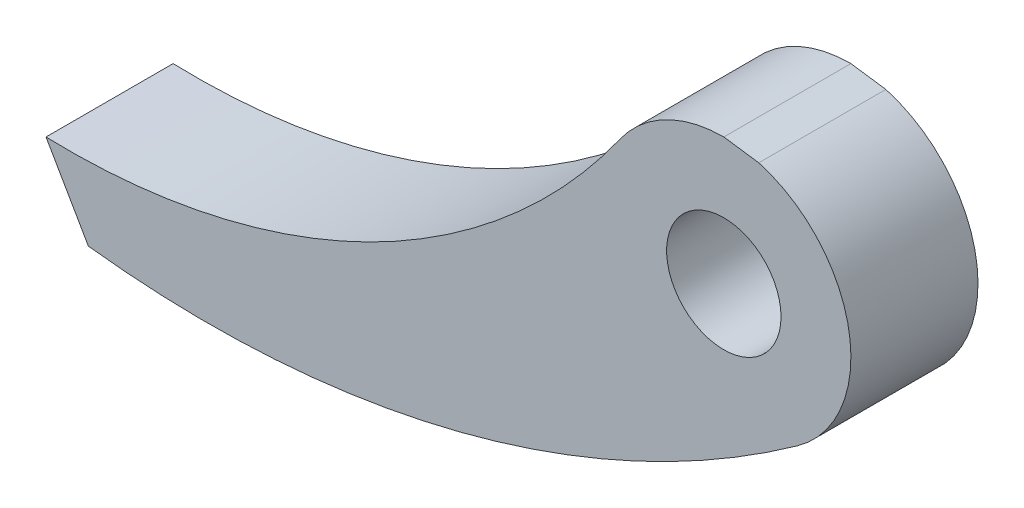
ISO-10303-21;
HEADER;
FILE_DESCRIPTION(('STEP AP214'),'2;1');
FILE_NAME('part.step','',(''),(''),'','','');
FILE_SCHEMA(('AUTOMOTIVE_DESIGN { 1 0 10303 214 1 1 1 1 }'));
ENDSEC;
DATA;
#1=APPLICATION_CONTEXT('core data for automotive mechanical design processes');
#2=APPLICATION_PROTOCOL_DEFINITION('international standard','automotive_design',2000,#1);
#3=PRODUCT_CONTEXT('',#1,'mechanical');
#4=PRODUCT('Part','Part','',(#3));
#5=PRODUCT_RELATED_PRODUCT_CATEGORY('part','',(#4));
#6=PRODUCT_DEFINITION_FORMATION('','',#4);
#7=PRODUCT_DEFINITION_CONTEXT('part definition',#1,'design');
#8=PRODUCT_DEFINITION('design','',#6,#7);
#9=PRODUCT_DEFINITION_SHAPE('','',#8);
#10=(LENGTH_UNIT() NAMED_UNIT(*) SI_UNIT(.MILLI.,.METRE.));
#11=(NAMED_UNIT(*) PLANE_ANGLE_UNIT() SI_UNIT($,.RADIAN.));
#12=(NAMED_UNIT(*) SI_UNIT($,.STERADIAN.) SOLID_ANGLE_UNIT());
#13=UNCERTAINTY_MEASURE_WITH_UNIT(LENGTH_MEASURE(1.E-05),#10,'distance_accuracy_value','');
#14=(GEOMETRIC_REPRESENTATION_CONTEXT(3) GLOBAL_UNCERTAINTY_ASSIGNED_CONTEXT((#13)) GLOBAL_UNIT_ASSIGNED_CONTEXT((#10,
#11,#12)) REPRESENTATION_CONTEXT('',''));
#15=CARTESIAN_POINT('',(0.,0.,0.));
#16=DIRECTION('',(0.,0.,1.));
#17=DIRECTION('',(1.,0.,0.));
#18=AXIS2_PLACEMENT_3D('',#15,#16,#17);
#19=CARTESIAN_POINT('',(-12.1863189266753,17.1024451765633,1.5));
#20=DIRECTION('',(0.,0.,-1.));
#21=DIRECTION('',(-1.,0.,0.));
#22=AXIS2_PLACEMENT_3D('',#19,#20,#21);
#23=CYLINDRICAL_SURFACE('',#22,24.);
#24=CARTESIAN_POINT('',(-12.1863189266753,17.1024451765633,-1.5));
#25=DIRECTION('',(0.,0.,1.));
#26=DIRECTION('',(1.,0.,0.));
#27=AXIS2_PLACEMENT_3D('',#24,#25,#26);
#28=CIRCLE('',#27,24.);
#29=CARTESIAN_POINT('',(-15.,-6.73205080756887,-1.5));
#30=VERTEX_POINT('',#29);
#31=CARTESIAN_POINT('',(1.74090270381076,-2.44320645379476,-1.5));
#32=VERTEX_POINT('',#31);
#33=EDGE_CURVE('E131',#30,#32,#28,.T.);
#34=ORIENTED_EDGE('',*,*,#33,.T.);
#35=DIRECTION('',(0.,0.,-1.));
#36=VECTOR('',#35,1.);
#37=CARTESIAN_POINT('',(1.74090270381076,-2.44320645379476,1.5));
#38=LINE('',#37,#36);
#39=CARTESIAN_POINT('',(1.74090270381076,-2.44320645379476,1.5));
#40=VERTEX_POINT('',#39);
#41=EDGE_CURVE('E11',#40,#32,#38,.T.);
#42=ORIENTED_EDGE('',*,*,#41,.F.);
#43=CARTESIAN_POINT('',(-12.1863189266753,17.1024451765633,1.5));
#44=DIRECTION('',(0.,0.,1.));
#45=DIRECTION('',(1.,0.,0.));
#46=AXIS2_PLACEMENT_3D('',#43,#44,#45);
#47=CIRCLE('',#46,24.);
#48=CARTESIAN_POINT('',(-15.,-6.73205080756887,1.5));
#49=VERTEX_POINT('',#48);
#50=EDGE_CURVE('E146',#49,#40,#47,.T.);
#51=ORIENTED_EDGE('',*,*,#50,.F.);
#52=DIRECTION('',(0.,0.,-1.));
#53=VECTOR('',#52,1.);
#54=CARTESIAN_POINT('',(-15.,-6.73205080756887,1.5));
#55=LINE('',#54,#53);
#56=EDGE_CURVE('E130',#49,#30,#55,.T.);
#57=ORIENTED_EDGE('',*,*,#56,.T.);
#58=EDGE_LOOP('',(#34,#42,#51,#57));
#59=FACE_BOUND('',#58,.T.);
#60=ADVANCED_FACE('F45',(#59),#23,.T.);
#61=CARTESIAN_POINT('',(0.,0.,1.5));
#62=DIRECTION('',(0.,0.,-1.));
#63=DIRECTION('',(-1.,0.,0.));
#64=AXIS2_PLACEMENT_3D('',#61,#62,#63);
#65=CYLINDRICAL_SURFACE('',#64,3.);
#66=CARTESIAN_POINT('',(0.,0.,-1.5));
#67=DIRECTION('',(0.,0.,1.));
#68=DIRECTION('',(1.,0.,0.));
#69=AXIS2_PLACEMENT_3D('',#66,#67,#68);
#70=CIRCLE('',#69,3.);
#71=CARTESIAN_POINT('',(0.824491602471951,2.88447804593019,-1.5));
#72=VERTEX_POINT('',#71);
#73=EDGE_CURVE('E134',#32,#72,#70,.T.);
#74=ORIENTED_EDGE('',*,*,#73,.T.);
#75=DIRECTION('',(0.,0.,-1.));
#76=VECTOR('',#75,1.);
#77=CARTESIAN_POINT('',(0.824491602471951,2.88447804593019,1.5));
#78=LINE('',#77,#76);
#79=CARTESIAN_POINT('',(0.824491602471951,2.88447804593019,1.5));
#80=VERTEX_POINT('',#79);
#81=EDGE_CURVE('E53',#80,#72,#78,.T.);
#82=ORIENTED_EDGE('',*,*,#81,.F.);
#83=CARTESIAN_POINT('',(0.,0.,1.5));
#84=DIRECTION('',(0.,0.,1.));
#85=DIRECTION('',(1.,0.,0.));
#86=AXIS2_PLACEMENT_3D('',#83,#84,#85);
#87=CIRCLE('',#86,3.);
#88=EDGE_CURVE('E94',#40,#80,#87,.T.);
#89=ORIENTED_EDGE('',*,*,#88,.F.);
#90=ORIENTED_EDGE('',*,*,#41,.T.);
#91=EDGE_LOOP('',(#74,#82,#89,#90));
#92=FACE_BOUND('',#91,.T.);
#93=ADVANCED_FACE('F152',(#92),#65,.T.);
#94=CARTESIAN_POINT('',(0.412245801235974,2.94223902296509,1.5));
#95=DIRECTION('',(0.138757554791209,0.990326381042313,0.));
#96=DIRECTION('',(-0.990326381042313,0.138757554791209,0.));
#97=AXIS2_PLACEMENT_3D('',#94,#95,#96);
#98=PLANE('',#97);
#99=DIRECTION('',(0.990326381042313,-0.138757554791209,0.));
#100=VECTOR('',#99,1.);
#101=CARTESIAN_POINT('',(0.412245801235974,2.94223902296509,-1.5));
#102=LINE('',#101,#100);
#103=CARTESIAN_POINT('',(0.,3.,-1.5));
#104=VERTEX_POINT('',#103);
#105=EDGE_CURVE('E137',#104,#72,#102,.T.);
#106=ORIENTED_EDGE('',*,*,#105,.F.);
#107=DIRECTION('',(0.,0.,-1.));
#108=VECTOR('',#107,1.);
#109=CARTESIAN_POINT('',(0.,3.,1.5));
#110=LINE('',#109,#108);
#111=CARTESIAN_POINT('',(0.,3.,1.5));
#112=VERTEX_POINT('',#111);
#113=EDGE_CURVE('E120',#112,#104,#110,.T.);
#114=ORIENTED_EDGE('',*,*,#113,.F.);
#115=DIRECTION('',(0.990326381042313,-0.138757554791209,0.));
#116=VECTOR('',#115,1.);
#117=CARTESIAN_POINT('',(0.412245801235974,2.94223902296509,1.5));
#118=LINE('',#117,#116);
#119=EDGE_CURVE('E109',#112,#80,#118,.T.);
#120=ORIENTED_EDGE('',*,*,#119,.T.);
#121=ORIENTED_EDGE('',*,*,#81,.T.);
#122=EDGE_LOOP('',(#106,#114,#120,#121));
#123=FACE_BOUND('',#122,.T.);
#124=ADVANCED_FACE('F151',(#123),#98,.T.);
#125=CARTESIAN_POINT('',(-2.44697902777808,1.73559604678458,-1.5));
#126=VERTEX_POINT('',#125);
#127=EDGE_CURVE('E116',#104,#126,#70,.T.);
#128=ORIENTED_EDGE('',*,*,#127,.T.);
#129=DIRECTION('',(0.,0.,-1.));
#130=VECTOR('',#129,1.);
#131=CARTESIAN_POINT('',(-2.44697902777808,1.73559604678458,1.5));
#132=LINE('',#131,#130);
#133=CARTESIAN_POINT('',(-2.44697902777808,1.73559604678458,1.5));
#134=VERTEX_POINT('',#133);
#135=EDGE_CURVE('E113',#134,#126,#132,.T.);
#136=ORIENTED_EDGE('',*,*,#135,.F.);
#137=EDGE_CURVE('E102',#112,#134,#87,.T.);
#138=ORIENTED_EDGE('',*,*,#137,.F.);
#139=ORIENTED_EDGE('',*,*,#113,.T.);
#140=EDGE_LOOP('',(#128,#136,#138,#139));
#141=FACE_BOUND('',#140,.T.);
#142=ADVANCED_FACE('F114',(#141),#65,.T.);
#143=CARTESIAN_POINT('',(-15.4975338425945,10.9921082963023,1.5));
#144=DIRECTION('',(0.,0.,-1.));
#145=DIRECTION('',(-1.,0.,0.));
#146=AXIS2_PLACEMENT_3D('',#143,#144,#145);
#147=CYLINDRICAL_SURFACE('',#146,16.);
#148=CARTESIAN_POINT('',(-15.4975338425945,10.9921082963023,-1.5));
#149=DIRECTION('',(0.,0.,1.));
#150=DIRECTION('',(1.,0.,0.));
#151=AXIS2_PLACEMENT_3D('',#148,#149,#150);
#152=CIRCLE('',#151,16.);
#153=CARTESIAN_POINT('',(-16.,-5.,-1.5));
#154=VERTEX_POINT('',#153);
#155=EDGE_CURVE('E140',#154,#126,#152,.T.);
#156=ORIENTED_EDGE('',*,*,#155,.F.);
#157=DIRECTION('',(0.,0.,-1.));
#158=VECTOR('',#157,1.);
#159=CARTESIAN_POINT('',(-16.,-5.,1.5));
#160=LINE('',#159,#158);
#161=CARTESIAN_POINT('',(-16.,-5.,1.5));
#162=VERTEX_POINT('',#161);
#163=EDGE_CURVE('E83',#162,#154,#160,.T.);
#164=ORIENTED_EDGE('',*,*,#163,.F.);
#165=CARTESIAN_POINT('',(-15.4975338425945,10.9921082963023,1.5));
#166=DIRECTION('',(0.,0.,1.));
#167=DIRECTION('',(1.,0.,0.));
#168=AXIS2_PLACEMENT_3D('',#165,#166,#167);
#169=CIRCLE('',#168,16.);
#170=EDGE_CURVE('E107',#162,#134,#169,.T.);
#171=ORIENTED_EDGE('',*,*,#170,.T.);
#172=ORIENTED_EDGE('',*,*,#135,.T.);
#173=EDGE_LOOP('',(#156,#164,#171,#172));
#174=FACE_BOUND('',#173,.T.);
#175=ADVANCED_FACE('F122',(#174),#147,.F.);
#176=CARTESIAN_POINT('',(-14.1650635094611,-8.17820323027555,1.5));
#177=DIRECTION('',(0.866025403784437,0.500000000000003,0.));
#178=DIRECTION('',(-0.500000000000003,0.866025403784437,0.));
#179=AXIS2_PLACEMENT_3D('',#176,#177,#178);
#180=PLANE('',#179);
#181=DIRECTION('',(0.500000000000003,-0.866025403784437,0.));
#182=VECTOR('',#181,1.);
#183=CARTESIAN_POINT('',(-14.1650635094611,-8.17820323027555,-1.5));
#184=LINE('',#183,#182);
#185=EDGE_CURVE('E86',#154,#30,#184,.T.);
#186=ORIENTED_EDGE('',*,*,#185,.T.);
#187=ORIENTED_EDGE('',*,*,#56,.F.);
#188=DIRECTION('',(0.500000000000003,-0.866025403784437,0.));
#189=VECTOR('',#188,1.);
#190=CARTESIAN_POINT('',(-14.1650635094611,-8.17820323027555,1.5));
#191=LINE('',#190,#189);
#192=EDGE_CURVE('E61',#162,#49,#191,.T.);
#193=ORIENTED_EDGE('',*,*,#192,.F.);
#194=ORIENTED_EDGE('',*,*,#163,.T.);
#195=EDGE_LOOP('',(#186,#187,#193,#194));
#196=FACE_BOUND('',#195,.T.);
#197=ADVANCED_FACE('F160',(#196),#180,.F.);
#198=CARTESIAN_POINT('',(0.,0.,1.5));
#199=DIRECTION('',(0.,0.,-1.));
#200=DIRECTION('',(-1.,0.,0.));
#201=AXIS2_PLACEMENT_3D('',#198,#199,#200);
#202=CYLINDRICAL_SURFACE('',#201,1.35);
#203=CARTESIAN_POINT('',(0.,0.,1.5));
#204=DIRECTION('',(0.,0.,1.));
#205=DIRECTION('',(1.,0.,0.));
#206=AXIS2_PLACEMENT_3D('',#203,#204,#205);
#207=CIRCLE('',#206,1.35);
#208=CARTESIAN_POINT('',(1.35,0.,1.5));
#209=VERTEX_POINT('',#208);
#210=EDGE_CURVE('E124',#209,#209,#207,.T.);
#211=ORIENTED_EDGE('',*,*,#210,.T.);
#212=EDGE_LOOP('',(#211));
#213=FACE_BOUND('',#212,.T.);
#214=CARTESIAN_POINT('',(0.,0.,-1.5));
#215=DIRECTION('',(0.,0.,1.));
#216=DIRECTION('',(1.,0.,0.));
#217=AXIS2_PLACEMENT_3D('',#214,#215,#216);
#218=CIRCLE('',#217,1.35);
#219=CARTESIAN_POINT('',(1.35,0.,-1.5));
#220=VERTEX_POINT('',#219);
#221=EDGE_CURVE('E143',#220,#220,#218,.T.);
#222=ORIENTED_EDGE('',*,*,#221,.F.);
#223=EDGE_LOOP('',(#222));
#224=FACE_BOUND('',#223,.T.);
#225=ADVANCED_FACE('F162',(#213,#224),#202,.F.);
#226=CARTESIAN_POINT('',(0.,0.,1.5));
#227=DIRECTION('',(0.,0.,1.));
#228=DIRECTION('',(1.,0.,0.));
#229=AXIS2_PLACEMENT_3D('',#226,#227,#228);
#230=PLANE('',#229);
#231=ORIENTED_EDGE('',*,*,#50,.T.);
#232=ORIENTED_EDGE('',*,*,#88,.T.);
#233=ORIENTED_EDGE('',*,*,#119,.F.);
#234=ORIENTED_EDGE('',*,*,#137,.T.);
#235=ORIENTED_EDGE('',*,*,#170,.F.);
#236=ORIENTED_EDGE('',*,*,#192,.T.);
#237=EDGE_LOOP('',(#231,#232,#233,#234,#235,#236));
#238=FACE_BOUND('',#237,.T.);
#239=ORIENTED_EDGE('',*,*,#210,.F.);
#240=EDGE_LOOP('',(#239));
#241=FACE_BOUND('',#240,.T.);
#242=ADVANCED_FACE('F104',(#238,#241),#230,.T.);
#243=CARTESIAN_POINT('',(0.,0.,-1.5));
#244=DIRECTION('',(0.,0.,1.));
#245=DIRECTION('',(1.,0.,0.));
#246=AXIS2_PLACEMENT_3D('',#243,#244,#245);
#247=PLANE('',#246);
#248=ORIENTED_EDGE('',*,*,#33,.F.);
#249=ORIENTED_EDGE('',*,*,#185,.F.);
#250=ORIENTED_EDGE('',*,*,#155,.T.);
#251=ORIENTED_EDGE('',*,*,#127,.F.);
#252=ORIENTED_EDGE('',*,*,#105,.T.);
#253=ORIENTED_EDGE('',*,*,#73,.F.);
#254=EDGE_LOOP('',(#248,#249,#250,#251,#252,#253));
#255=FACE_BOUND('',#254,.T.);
#256=ORIENTED_EDGE('',*,*,#221,.T.);
#257=EDGE_LOOP('',(#256));
#258=FACE_BOUND('',#257,.T.);
#259=ADVANCED_FACE('F156',(#255,#258),#247,.F.);
#260=CLOSED_SHELL('',(#60,#93,#124,#142,#175,#197,#225,#242,#259));
#261=MANIFOLD_SOLID_BREP('B2',#260);
#262=ADVANCED_BREP_SHAPE_REPRESENTATION('',(#18,#261),#14);
#263=SHAPE_DEFINITION_REPRESENTATION(#9,#262);
ENDSEC;
END-ISO-10303-21;
